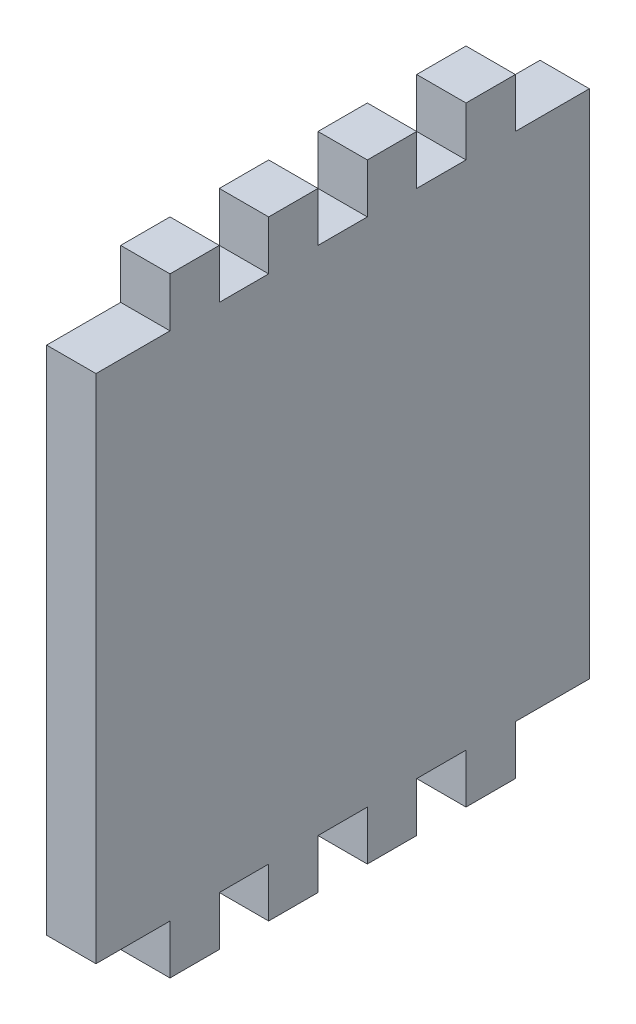
ISO-10303-21;
HEADER;
FILE_DESCRIPTION(('STEP AP214'),'2;1');
FILE_NAME('part.step','',(''),(''),'','','');
FILE_SCHEMA(('AUTOMOTIVE_DESIGN { 1 0 10303 214 1 1 1 1 }'));
ENDSEC;
DATA;
#1=APPLICATION_CONTEXT('core data for automotive mechanical design processes');
#2=APPLICATION_PROTOCOL_DEFINITION('international standard','automotive_design',2000,#1);
#3=PRODUCT_CONTEXT('',#1,'mechanical');
#4=PRODUCT('Part','Part','',(#3));
#5=PRODUCT_RELATED_PRODUCT_CATEGORY('part','',(#4));
#6=PRODUCT_DEFINITION_FORMATION('','',#4);
#7=PRODUCT_DEFINITION_CONTEXT('part definition',#1,'design');
#8=PRODUCT_DEFINITION('design','',#6,#7);
#9=PRODUCT_DEFINITION_SHAPE('','',#8);
#10=(LENGTH_UNIT() NAMED_UNIT(*) SI_UNIT(.MILLI.,.METRE.));
#11=(NAMED_UNIT(*) PLANE_ANGLE_UNIT() SI_UNIT($,.RADIAN.));
#12=(NAMED_UNIT(*) SI_UNIT($,.STERADIAN.) SOLID_ANGLE_UNIT());
#13=UNCERTAINTY_MEASURE_WITH_UNIT(LENGTH_MEASURE(1.E-05),#10,'distance_accuracy_value','');
#14=(GEOMETRIC_REPRESENTATION_CONTEXT(3) GLOBAL_UNCERTAINTY_ASSIGNED_CONTEXT((#13)) GLOBAL_UNIT_ASSIGNED_CONTEXT((#10,
#11,#12)) REPRESENTATION_CONTEXT('',''));
#15=CARTESIAN_POINT('',(0.,0.,0.));
#16=DIRECTION('',(0.,0.,1.));
#17=DIRECTION('',(1.,0.,0.));
#18=AXIS2_PLACEMENT_3D('',#15,#16,#17);
#19=CARTESIAN_POINT('',(5.08,-38.5418998104265,20.2236966824645));
#20=DIRECTION('',(0.,1.,0.));
#21=DIRECTION('',(0.,0.,1.));
#22=AXIS2_PLACEMENT_3D('',#19,#20,#21);
#23=PLANE('',#22);
#24=DIRECTION('',(0.,0.,-1.));
#25=VECTOR('',#24,1.);
#26=CARTESIAN_POINT('',(5.08,-38.5418998104265,20.2236966824645));
#27=LINE('',#26,#25);
#28=CARTESIAN_POINT('',(5.08,-38.5418998104265,-12.7963033175355));
#29=VERTEX_POINT('',#28);
#30=CARTESIAN_POINT('',(5.08,-38.5418998104265,-17.8763033175355));
#31=VERTEX_POINT('',#30);
#32=EDGE_CURVE('E55',#29,#31,#27,.T.);
#33=ORIENTED_EDGE('',*,*,#32,.F.);
#34=DIRECTION('',(1.,0.,0.));
#35=VECTOR('',#34,1.);
#36=CARTESIAN_POINT('',(0.,-38.5418998104265,-12.7963033175355));
#37=LINE('',#36,#35);
#38=CARTESIAN_POINT('',(0.,-38.5418998104265,-12.7963033175355));
#39=VERTEX_POINT('',#38);
#40=EDGE_CURVE('E314',#39,#29,#37,.T.);
#41=ORIENTED_EDGE('',*,*,#40,.F.);
#42=DIRECTION('',(0.,0.,-1.));
#43=VECTOR('',#42,1.);
#44=CARTESIAN_POINT('',(0.,-38.5418998104265,20.2236966824645));
#45=LINE('',#44,#43);
#46=CARTESIAN_POINT('',(0.,-38.5418998104265,-17.8763033175355));
#47=VERTEX_POINT('',#46);
#48=EDGE_CURVE('E613',#39,#47,#45,.T.);
#49=ORIENTED_EDGE('',*,*,#48,.T.);
#50=DIRECTION('',(1.,0.,0.));
#51=VECTOR('',#50,1.);
#52=CARTESIAN_POINT('',(0.,-38.5418998104265,-17.8763033175355));
#53=LINE('',#52,#51);
#54=EDGE_CURVE('E335',#47,#31,#53,.T.);
#55=ORIENTED_EDGE('',*,*,#54,.T.);
#56=EDGE_LOOP('',(#33,#41,#49,#55));
#57=FACE_BOUND('',#56,.T.);
#58=ADVANCED_FACE('F39',(#57),#23,.F.);
#59=CARTESIAN_POINT('',(5.08,-38.5418998104265,-22.9563033175355));
#60=VERTEX_POINT('',#59);
#61=CARTESIAN_POINT('',(5.08,-38.5418998104265,-30.5763033175355));
#62=VERTEX_POINT('',#61);
#63=EDGE_CURVE('E584',#60,#62,#27,.T.);
#64=ORIENTED_EDGE('',*,*,#63,.F.);
#65=DIRECTION('',(1.,0.,0.));
#66=VECTOR('',#65,1.);
#67=CARTESIAN_POINT('',(0.,-38.5418998104265,-22.9563033175355));
#68=LINE('',#67,#66);
#69=CARTESIAN_POINT('',(0.,-38.5418998104265,-22.9563033175355));
#70=VERTEX_POINT('',#69);
#71=EDGE_CURVE('E346',#70,#60,#68,.T.);
#72=ORIENTED_EDGE('',*,*,#71,.F.);
#73=CARTESIAN_POINT('',(0.,-38.5418998104265,-30.5763033175355));
#74=VERTEX_POINT('',#73);
#75=EDGE_CURVE('E607',#70,#74,#45,.T.);
#76=ORIENTED_EDGE('',*,*,#75,.T.);
#77=DIRECTION('',(-1.,0.,0.));
#78=VECTOR('',#77,1.);
#79=CARTESIAN_POINT('',(5.08,-38.5418998104265,-30.5763033175355));
#80=LINE('',#79,#78);
#81=EDGE_CURVE('E48',#62,#74,#80,.T.);
#82=ORIENTED_EDGE('',*,*,#81,.F.);
#83=EDGE_LOOP('',(#64,#72,#76,#82));
#84=FACE_BOUND('',#83,.T.);
#85=ADVANCED_FACE('F737',(#84),#23,.F.);
#86=CARTESIAN_POINT('',(5.08,-38.5418998104265,7.52369668246447));
#87=VERTEX_POINT('',#86);
#88=CARTESIAN_POINT('',(5.08,-38.5418998104265,2.44369668246447));
#89=VERTEX_POINT('',#88);
#90=EDGE_CURVE('E591',#87,#89,#27,.T.);
#91=ORIENTED_EDGE('',*,*,#90,.F.);
#92=DIRECTION('',(1.,0.,0.));
#93=VECTOR('',#92,1.);
#94=CARTESIAN_POINT('',(0.,-38.5418998104265,7.52369668246447));
#95=LINE('',#94,#93);
#96=CARTESIAN_POINT('',(0.,-38.5418998104265,7.52369668246447));
#97=VERTEX_POINT('',#96);
#98=EDGE_CURVE('E372',#97,#87,#95,.T.);
#99=ORIENTED_EDGE('',*,*,#98,.F.);
#100=CARTESIAN_POINT('',(0.,-38.5418998104265,2.44369668246447));
#101=VERTEX_POINT('',#100);
#102=EDGE_CURVE('E612',#97,#101,#45,.T.);
#103=ORIENTED_EDGE('',*,*,#102,.T.);
#104=DIRECTION('',(1.,0.,0.));
#105=VECTOR('',#104,1.);
#106=CARTESIAN_POINT('',(0.,-38.5418998104265,2.44369668246447));
#107=LINE('',#106,#105);
#108=EDGE_CURVE('E426',#101,#89,#107,.T.);
#109=ORIENTED_EDGE('',*,*,#108,.T.);
#110=EDGE_LOOP('',(#91,#99,#103,#109));
#111=FACE_BOUND('',#110,.T.);
#112=ADVANCED_FACE('F718',(#111),#23,.F.);
#113=CARTESIAN_POINT('',(0.,-38.5418998104265,-2.63630331753553));
#114=VERTEX_POINT('',#113);
#115=CARTESIAN_POINT('',(0.,-38.5418998104265,-7.71630331753552));
#116=VERTEX_POINT('',#115);
#117=EDGE_CURVE('E614',#114,#116,#45,.T.);
#118=ORIENTED_EDGE('',*,*,#117,.T.);
#119=DIRECTION('',(1.,0.,0.));
#120=VECTOR('',#119,1.);
#121=CARTESIAN_POINT('',(0.,-38.5418998104265,-7.71630331753552));
#122=LINE('',#121,#120);
#123=CARTESIAN_POINT('',(5.08,-38.5418998104265,-7.71630331753552));
#124=VERTEX_POINT('',#123);
#125=EDGE_CURVE('E63',#116,#124,#122,.T.);
#126=ORIENTED_EDGE('',*,*,#125,.T.);
#127=CARTESIAN_POINT('',(5.08,-38.5418998104265,-2.63630331753553));
#128=VERTEX_POINT('',#127);
#129=EDGE_CURVE('E592',#128,#124,#27,.T.);
#130=ORIENTED_EDGE('',*,*,#129,.F.);
#131=DIRECTION('',(1.,0.,0.));
#132=VECTOR('',#131,1.);
#133=CARTESIAN_POINT('',(0.,-38.5418998104265,-2.63630331753553));
#134=LINE('',#133,#132);
#135=EDGE_CURVE('E408',#114,#128,#134,.T.);
#136=ORIENTED_EDGE('',*,*,#135,.F.);
#137=EDGE_LOOP('',(#118,#126,#130,#136));
#138=FACE_BOUND('',#137,.T.);
#139=ADVANCED_FACE('F743',(#138),#23,.F.);
#140=CARTESIAN_POINT('',(5.08,14.0843601895735,20.2236966824645));
#141=DIRECTION('',(0.,-1.,0.));
#142=DIRECTION('',(0.,0.,-1.));
#143=AXIS2_PLACEMENT_3D('',#140,#141,#142);
#144=PLANE('',#143);
#145=DIRECTION('',(0.,0.,1.));
#146=VECTOR('',#145,1.);
#147=CARTESIAN_POINT('',(5.08,14.0843601895735,20.2236966824645));
#148=LINE('',#147,#146);
#149=CARTESIAN_POINT('',(5.08,14.0843601895735,2.44369668246448));
#150=VERTEX_POINT('',#149);
#151=CARTESIAN_POINT('',(5.08,14.0843601895735,7.52369668246448));
#152=VERTEX_POINT('',#151);
#153=EDGE_CURVE('E602',#150,#152,#148,.T.);
#154=ORIENTED_EDGE('',*,*,#153,.F.);
#155=DIRECTION('',(1.,0.,0.));
#156=VECTOR('',#155,1.);
#157=CARTESIAN_POINT('',(0.,14.0843601895735,2.44369668246448));
#158=LINE('',#157,#156);
#159=CARTESIAN_POINT('',(0.,14.0843601895735,2.44369668246448));
#160=VERTEX_POINT('',#159);
#161=EDGE_CURVE('E456',#160,#150,#158,.T.);
#162=ORIENTED_EDGE('',*,*,#161,.F.);
#163=DIRECTION('',(0.,0.,1.));
#164=VECTOR('',#163,1.);
#165=CARTESIAN_POINT('',(0.,14.0843601895735,20.2236966824645));
#166=LINE('',#165,#164);
#167=CARTESIAN_POINT('',(0.,14.0843601895735,7.52369668246448));
#168=VERTEX_POINT('',#167);
#169=EDGE_CURVE('E621',#160,#168,#166,.T.);
#170=ORIENTED_EDGE('',*,*,#169,.T.);
#171=DIRECTION('',(1.,0.,0.));
#172=VECTOR('',#171,1.);
#173=CARTESIAN_POINT('',(0.,14.0843601895735,7.52369668246448));
#174=LINE('',#173,#172);
#175=EDGE_CURVE('E482',#168,#152,#174,.T.);
#176=ORIENTED_EDGE('',*,*,#175,.T.);
#177=EDGE_LOOP('',(#154,#162,#170,#176));
#178=FACE_BOUND('',#177,.T.);
#179=ADVANCED_FACE('F679',(#178),#144,.F.);
#180=CARTESIAN_POINT('',(5.08,14.0843601895735,12.6036966824645));
#181=VERTEX_POINT('',#180);
#182=CARTESIAN_POINT('',(5.08,14.0843601895735,20.2236966824645));
#183=VERTEX_POINT('',#182);
#184=EDGE_CURVE('E595',#181,#183,#148,.T.);
#185=ORIENTED_EDGE('',*,*,#184,.F.);
#186=DIRECTION('',(1.,0.,0.));
#187=VECTOR('',#186,1.);
#188=CARTESIAN_POINT('',(0.,14.0843601895735,12.6036966824645));
#189=LINE('',#188,#187);
#190=CARTESIAN_POINT('',(0.,14.0843601895735,12.6036966824645));
#191=VERTEX_POINT('',#190);
#192=EDGE_CURVE('E493',#191,#181,#189,.T.);
#193=ORIENTED_EDGE('',*,*,#192,.F.);
#194=CARTESIAN_POINT('',(0.,14.0843601895735,20.2236966824645));
#195=VERTEX_POINT('',#194);
#196=EDGE_CURVE('E617',#191,#195,#166,.T.);
#197=ORIENTED_EDGE('',*,*,#196,.T.);
#198=DIRECTION('',(-1.,0.,0.));
#199=VECTOR('',#198,1.);
#200=CARTESIAN_POINT('',(5.08,14.0843601895735,20.2236966824645));
#201=LINE('',#200,#199);
#202=EDGE_CURVE('E600',#183,#195,#201,.T.);
#203=ORIENTED_EDGE('',*,*,#202,.F.);
#204=EDGE_LOOP('',(#185,#193,#197,#203));
#205=FACE_BOUND('',#204,.T.);
#206=ADVANCED_FACE('F698',(#205),#144,.F.);
#207=CARTESIAN_POINT('',(5.08,14.0843601895735,-17.8763033175355));
#208=VERTEX_POINT('',#207);
#209=CARTESIAN_POINT('',(5.08,14.0843601895735,-12.7963033175355));
#210=VERTEX_POINT('',#209);
#211=EDGE_CURVE('E601',#208,#210,#148,.T.);
#212=ORIENTED_EDGE('',*,*,#211,.F.);
#213=DIRECTION('',(1.,0.,0.));
#214=VECTOR('',#213,1.);
#215=CARTESIAN_POINT('',(0.,14.0843601895735,-17.8763033175355));
#216=LINE('',#215,#214);
#217=CARTESIAN_POINT('',(0.,14.0843601895735,-17.8763033175355));
#218=VERTEX_POINT('',#217);
#219=EDGE_CURVE('E520',#218,#208,#216,.T.);
#220=ORIENTED_EDGE('',*,*,#219,.F.);
#221=CARTESIAN_POINT('',(0.,14.0843601895735,-12.7963033175355));
#222=VERTEX_POINT('',#221);
#223=EDGE_CURVE('E620',#218,#222,#166,.T.);
#224=ORIENTED_EDGE('',*,*,#223,.T.);
#225=DIRECTION('',(1.,0.,0.));
#226=VECTOR('',#225,1.);
#227=CARTESIAN_POINT('',(0.,14.0843601895735,-12.7963033175355));
#228=LINE('',#227,#226);
#229=EDGE_CURVE('E574',#222,#210,#228,.T.);
#230=ORIENTED_EDGE('',*,*,#229,.T.);
#231=EDGE_LOOP('',(#212,#220,#224,#230));
#232=FACE_BOUND('',#231,.T.);
#233=ADVANCED_FACE('F668',(#232),#144,.F.);
#234=CARTESIAN_POINT('',(0.,14.0843601895735,-7.71630331753552));
#235=VERTEX_POINT('',#234);
#236=CARTESIAN_POINT('',(0.,14.0843601895735,-2.63630331753552));
#237=VERTEX_POINT('',#236);
#238=EDGE_CURVE('E622',#235,#237,#166,.T.);
#239=ORIENTED_EDGE('',*,*,#238,.T.);
#240=DIRECTION('',(1.,0.,0.));
#241=VECTOR('',#240,1.);
#242=CARTESIAN_POINT('',(0.,14.0843601895735,-2.63630331753552));
#243=LINE('',#242,#241);
#244=CARTESIAN_POINT('',(5.08,14.0843601895735,-2.63630331753552));
#245=VERTEX_POINT('',#244);
#246=EDGE_CURVE('E445',#237,#245,#243,.T.);
#247=ORIENTED_EDGE('',*,*,#246,.T.);
#248=CARTESIAN_POINT('',(5.08,14.0843601895735,-7.71630331753552));
#249=VERTEX_POINT('',#248);
#250=EDGE_CURVE('E603',#249,#245,#148,.T.);
#251=ORIENTED_EDGE('',*,*,#250,.F.);
#252=DIRECTION('',(1.,0.,0.));
#253=VECTOR('',#252,1.);
#254=CARTESIAN_POINT('',(0.,14.0843601895735,-7.71630331753552));
#255=LINE('',#254,#253);
#256=EDGE_CURVE('E556',#235,#249,#255,.T.);
#257=ORIENTED_EDGE('',*,*,#256,.F.);
#258=EDGE_LOOP('',(#239,#247,#251,#257));
#259=FACE_BOUND('',#258,.T.);
#260=ADVANCED_FACE('F775',(#259),#144,.F.);
#261=CARTESIAN_POINT('',(5.08,14.0843601895735,20.2236966824645));
#262=DIRECTION('',(0.,0.,-1.));
#263=DIRECTION('',(0.,1.,0.));
#264=AXIS2_PLACEMENT_3D('',#261,#262,#263);
#265=PLANE('',#264);
#266=DIRECTION('',(0.,-1.,0.));
#267=VECTOR('',#266,1.);
#268=CARTESIAN_POINT('',(0.,14.0843601895735,20.2236966824645));
#269=LINE('',#268,#267);
#270=CARTESIAN_POINT('',(0.,-38.5418998104265,20.2236966824645));
#271=VERTEX_POINT('',#270);
#272=EDGE_CURVE('E570',#195,#271,#269,.T.);
#273=ORIENTED_EDGE('',*,*,#272,.T.);
#274=DIRECTION('',(-1.,0.,0.));
#275=VECTOR('',#274,1.);
#276=CARTESIAN_POINT('',(5.08,-38.5418998104265,20.2236966824645));
#277=LINE('',#276,#275);
#278=CARTESIAN_POINT('',(5.08,-38.5418998104265,20.2236966824645));
#279=VERTEX_POINT('',#278);
#280=EDGE_CURVE('E11',#279,#271,#277,.T.);
#281=ORIENTED_EDGE('',*,*,#280,.F.);
#282=DIRECTION('',(0.,-1.,0.));
#283=VECTOR('',#282,1.);
#284=CARTESIAN_POINT('',(5.08,14.0843601895735,20.2236966824645));
#285=LINE('',#284,#283);
#286=EDGE_CURVE('E580',#183,#279,#285,.T.);
#287=ORIENTED_EDGE('',*,*,#286,.F.);
#288=ORIENTED_EDGE('',*,*,#202,.T.);
#289=EDGE_LOOP('',(#273,#281,#287,#288));
#290=FACE_BOUND('',#289,.T.);
#291=ADVANCED_FACE('F41',(#290),#265,.F.);
#292=CARTESIAN_POINT('',(0.,-38.5418998104265,12.6036966824645));
#293=VERTEX_POINT('',#292);
#294=EDGE_CURVE('E608',#271,#293,#45,.T.);
#295=ORIENTED_EDGE('',*,*,#294,.T.);
#296=DIRECTION('',(1.,0.,0.));
#297=VECTOR('',#296,1.);
#298=CARTESIAN_POINT('',(0.,-38.5418998104265,12.6036966824645));
#299=LINE('',#298,#297);
#300=CARTESIAN_POINT('',(5.08,-38.5418998104265,12.6036966824645));
#301=VERTEX_POINT('',#300);
#302=EDGE_CURVE('E390',#293,#301,#299,.T.);
#303=ORIENTED_EDGE('',*,*,#302,.T.);
#304=EDGE_CURVE('E586',#279,#301,#27,.T.);
#305=ORIENTED_EDGE('',*,*,#304,.F.);
#306=ORIENTED_EDGE('',*,*,#280,.T.);
#307=EDGE_LOOP('',(#295,#303,#305,#306));
#308=FACE_BOUND('',#307,.T.);
#309=ADVANCED_FACE('F701',(#308),#23,.F.);
#310=CARTESIAN_POINT('',(5.08,14.0843601895735,-30.5763033175355));
#311=DIRECTION('',(0.,0.,1.));
#312=DIRECTION('',(0.,-1.,0.));
#313=AXIS2_PLACEMENT_3D('',#310,#311,#312);
#314=PLANE('',#313);
#315=DIRECTION('',(0.,1.,0.));
#316=VECTOR('',#315,1.);
#317=CARTESIAN_POINT('',(0.,14.0843601895735,-30.5763033175355));
#318=LINE('',#317,#316);
#319=CARTESIAN_POINT('',(0.,14.0843601895735,-30.5763033175355));
#320=VERTEX_POINT('',#319);
#321=EDGE_CURVE('E611',#74,#320,#318,.T.);
#322=ORIENTED_EDGE('',*,*,#321,.T.);
#323=DIRECTION('',(-1.,0.,0.));
#324=VECTOR('',#323,1.);
#325=CARTESIAN_POINT('',(5.08,14.0843601895735,-30.5763033175355));
#326=LINE('',#325,#324);
#327=CARTESIAN_POINT('',(5.08,14.0843601895735,-30.5763033175355));
#328=VERTEX_POINT('',#327);
#329=EDGE_CURVE('E626',#328,#320,#326,.T.);
#330=ORIENTED_EDGE('',*,*,#329,.F.);
#331=DIRECTION('',(0.,1.,0.));
#332=VECTOR('',#331,1.);
#333=CARTESIAN_POINT('',(5.08,14.0843601895735,-30.5763033175355));
#334=LINE('',#333,#332);
#335=EDGE_CURVE('E590',#62,#328,#334,.T.);
#336=ORIENTED_EDGE('',*,*,#335,.F.);
#337=ORIENTED_EDGE('',*,*,#81,.T.);
#338=EDGE_LOOP('',(#322,#330,#336,#337));
#339=FACE_BOUND('',#338,.T.);
#340=ADVANCED_FACE('F635',(#339),#314,.F.);
#341=CARTESIAN_POINT('',(0.,14.0843601895735,-22.9563033175355));
#342=VERTEX_POINT('',#341);
#343=EDGE_CURVE('E585',#320,#342,#166,.T.);
#344=ORIENTED_EDGE('',*,*,#343,.T.);
#345=DIRECTION('',(1.,0.,0.));
#346=VECTOR('',#345,1.);
#347=CARTESIAN_POINT('',(0.,14.0843601895735,-22.9563033175355));
#348=LINE('',#347,#346);
#349=CARTESIAN_POINT('',(5.08,14.0843601895735,-22.9563033175355));
#350=VERTEX_POINT('',#349);
#351=EDGE_CURVE('E538',#342,#350,#348,.T.);
#352=ORIENTED_EDGE('',*,*,#351,.T.);
#353=EDGE_CURVE('E596',#328,#350,#148,.T.);
#354=ORIENTED_EDGE('',*,*,#353,.F.);
#355=ORIENTED_EDGE('',*,*,#329,.T.);
#356=EDGE_LOOP('',(#344,#352,#354,#355));
#357=FACE_BOUND('',#356,.T.);
#358=ADVANCED_FACE('F645',(#357),#144,.F.);
#359=CARTESIAN_POINT('',(5.08,0.,0.));
#360=DIRECTION('',(1.,0.,0.));
#361=DIRECTION('',(0.,0.,-1.));
#362=AXIS2_PLACEMENT_3D('',#359,#360,#361);
#363=PLANE('',#362);
#364=ORIENTED_EDGE('',*,*,#286,.T.);
#365=ORIENTED_EDGE('',*,*,#304,.T.);
#366=DIRECTION('',(0.,-1.,0.));
#367=VECTOR('',#366,1.);
#368=CARTESIAN_POINT('',(5.08,-38.5418998104265,12.6036966824645));
#369=LINE('',#368,#367);
#370=CARTESIAN_POINT('',(5.08,-43.6218998104266,12.6036966824645));
#371=VERTEX_POINT('',#370);
#372=EDGE_CURVE('E376',#301,#371,#369,.T.);
#373=ORIENTED_EDGE('',*,*,#372,.T.);
#374=DIRECTION('',(0.,0.,-1.));
#375=VECTOR('',#374,1.);
#376=CARTESIAN_POINT('',(5.08,-43.6218998104265,7.52369668246447));
#377=LINE('',#376,#375);
#378=CARTESIAN_POINT('',(5.08,-43.6218998104265,7.52369668246447));
#379=VERTEX_POINT('',#378);
#380=EDGE_CURVE('E364',#371,#379,#377,.T.);
#381=ORIENTED_EDGE('',*,*,#380,.T.);
#382=DIRECTION('',(0.,1.,0.));
#383=VECTOR('',#382,1.);
#384=CARTESIAN_POINT('',(5.08,-38.5418998104265,7.52369668246447));
#385=LINE('',#384,#383);
#386=EDGE_CURVE('E350',#379,#87,#385,.T.);
#387=ORIENTED_EDGE('',*,*,#386,.T.);
#388=ORIENTED_EDGE('',*,*,#90,.T.);
#389=DIRECTION('',(0.,-1.,0.));
#390=VECTOR('',#389,1.);
#391=CARTESIAN_POINT('',(5.08,-38.5418998104265,2.44369668246447));
#392=LINE('',#391,#390);
#393=CARTESIAN_POINT('',(5.08,-43.6218998104265,2.44369668246447));
#394=VERTEX_POINT('',#393);
#395=EDGE_CURVE('E412',#89,#394,#392,.T.);
#396=ORIENTED_EDGE('',*,*,#395,.T.);
#397=DIRECTION('',(0.,0.,-1.));
#398=VECTOR('',#397,1.);
#399=CARTESIAN_POINT('',(5.08,-43.6218998104265,-2.63630331753553));
#400=LINE('',#399,#398);
#401=CARTESIAN_POINT('',(5.08,-43.6218998104265,-2.63630331753553));
#402=VERTEX_POINT('',#401);
#403=EDGE_CURVE('E400',#394,#402,#400,.T.);
#404=ORIENTED_EDGE('',*,*,#403,.T.);
#405=DIRECTION('',(0.,1.,0.));
#406=VECTOR('',#405,1.);
#407=CARTESIAN_POINT('',(5.08,-38.5418998104265,-2.63630331753553));
#408=LINE('',#407,#406);
#409=EDGE_CURVE('E386',#402,#128,#408,.T.);
#410=ORIENTED_EDGE('',*,*,#409,.T.);
#411=ORIENTED_EDGE('',*,*,#129,.T.);
#412=DIRECTION('',(0.,-1.,0.));
#413=VECTOR('',#412,1.);
#414=CARTESIAN_POINT('',(5.08,-38.5418998104265,-7.71630331753552));
#415=LINE('',#414,#413);
#416=CARTESIAN_POINT('',(5.08,-43.6218998104265,-7.71630331753552));
#417=VERTEX_POINT('',#416);
#418=EDGE_CURVE('E309',#124,#417,#415,.T.);
#419=ORIENTED_EDGE('',*,*,#418,.T.);
#420=DIRECTION('',(0.,0.,-1.));
#421=VECTOR('',#420,1.);
#422=CARTESIAN_POINT('',(5.08,-43.6218998104265,-7.71630331753552));
#423=LINE('',#422,#421);
#424=CARTESIAN_POINT('',(5.08,-43.6218998104265,-12.7963033175355));
#425=VERTEX_POINT('',#424);
#426=EDGE_CURVE('E281',#417,#425,#423,.T.);
#427=ORIENTED_EDGE('',*,*,#426,.T.);
#428=DIRECTION('',(0.,1.,0.));
#429=VECTOR('',#428,1.);
#430=CARTESIAN_POINT('',(5.08,-38.5418998104265,-12.7963033175355));
#431=LINE('',#430,#429);
#432=EDGE_CURVE('E301',#425,#29,#431,.T.);
#433=ORIENTED_EDGE('',*,*,#432,.T.);
#434=ORIENTED_EDGE('',*,*,#32,.T.);
#435=DIRECTION('',(0.,-1.,0.));
#436=VECTOR('',#435,1.);
#437=CARTESIAN_POINT('',(5.08,-38.5418998104265,-17.8763033175355));
#438=LINE('',#437,#436);
#439=CARTESIAN_POINT('',(5.08,-43.6218998104265,-17.8763033175355));
#440=VERTEX_POINT('',#439);
#441=EDGE_CURVE('E317',#31,#440,#438,.T.);
#442=ORIENTED_EDGE('',*,*,#441,.T.);
#443=DIRECTION('',(0.,0.,-1.));
#444=VECTOR('',#443,1.);
#445=CARTESIAN_POINT('',(5.08,-43.6218998104265,-17.8763033175355));
#446=LINE('',#445,#444);
#447=CARTESIAN_POINT('',(5.08,-43.6218998104265,-22.9563033175355));
#448=VERTEX_POINT('',#447);
#449=EDGE_CURVE('E339',#440,#448,#446,.T.);
#450=ORIENTED_EDGE('',*,*,#449,.T.);
#451=DIRECTION('',(0.,1.,0.));
#452=VECTOR('',#451,1.);
#453=CARTESIAN_POINT('',(5.08,-38.5418998104265,-22.9563033175355));
#454=LINE('',#453,#452);
#455=EDGE_CURVE('E327',#448,#60,#454,.T.);
#456=ORIENTED_EDGE('',*,*,#455,.T.);
#457=ORIENTED_EDGE('',*,*,#63,.T.);
#458=ORIENTED_EDGE('',*,*,#335,.T.);
#459=ORIENTED_EDGE('',*,*,#353,.T.);
#460=DIRECTION('',(0.,1.,0.));
#461=VECTOR('',#460,1.);
#462=CARTESIAN_POINT('',(5.08,14.0843601895735,-22.9563033175355));
#463=LINE('',#462,#461);
#464=CARTESIAN_POINT('',(5.08,19.1643601895735,-22.9563033175355));
#465=VERTEX_POINT('',#464);
#466=EDGE_CURVE('E524',#350,#465,#463,.T.);
#467=ORIENTED_EDGE('',*,*,#466,.T.);
#468=DIRECTION('',(0.,0.,1.));
#469=VECTOR('',#468,1.);
#470=CARTESIAN_POINT('',(5.08,19.1643601895735,-17.8763033175355));
#471=LINE('',#470,#469);
#472=CARTESIAN_POINT('',(5.08,19.1643601895735,-17.8763033175355));
#473=VERTEX_POINT('',#472);
#474=EDGE_CURVE('E512',#465,#473,#471,.T.);
#475=ORIENTED_EDGE('',*,*,#474,.T.);
#476=DIRECTION('',(0.,-1.,0.));
#477=VECTOR('',#476,1.);
#478=CARTESIAN_POINT('',(5.08,14.0843601895735,-17.8763033175355));
#479=LINE('',#478,#477);
#480=EDGE_CURVE('E497',#473,#208,#479,.T.);
#481=ORIENTED_EDGE('',*,*,#480,.T.);
#482=ORIENTED_EDGE('',*,*,#211,.T.);
#483=DIRECTION('',(0.,1.,0.));
#484=VECTOR('',#483,1.);
#485=CARTESIAN_POINT('',(5.08,14.0843601895735,-12.7963033175355));
#486=LINE('',#485,#484);
#487=CARTESIAN_POINT('',(5.08,19.1643601895735,-12.7963033175355));
#488=VERTEX_POINT('',#487);
#489=EDGE_CURVE('E560',#210,#488,#486,.T.);
#490=ORIENTED_EDGE('',*,*,#489,.T.);
#491=DIRECTION('',(0.,0.,1.));
#492=VECTOR('',#491,1.);
#493=CARTESIAN_POINT('',(5.08,19.1643601895735,-7.71630331753552));
#494=LINE('',#493,#492);
#495=CARTESIAN_POINT('',(5.08,19.1643601895735,-7.71630331753552));
#496=VERTEX_POINT('',#495);
#497=EDGE_CURVE('E548',#488,#496,#494,.T.);
#498=ORIENTED_EDGE('',*,*,#497,.T.);
#499=DIRECTION('',(0.,-1.,0.));
#500=VECTOR('',#499,1.);
#501=CARTESIAN_POINT('',(5.08,14.0843601895735,-7.71630331753552));
#502=LINE('',#501,#500);
#503=EDGE_CURVE('E534',#496,#249,#502,.T.);
#504=ORIENTED_EDGE('',*,*,#503,.T.);
#505=ORIENTED_EDGE('',*,*,#250,.T.);
#506=DIRECTION('',(0.,1.,0.));
#507=VECTOR('',#506,1.);
#508=CARTESIAN_POINT('',(5.08,14.0843601895735,-2.63630331753552));
#509=LINE('',#508,#507);
#510=CARTESIAN_POINT('',(5.08,19.1643601895735,-2.63630331753552));
#511=VERTEX_POINT('',#510);
#512=EDGE_CURVE('E422',#245,#511,#509,.T.);
#513=ORIENTED_EDGE('',*,*,#512,.T.);
#514=DIRECTION('',(0.,0.,1.));
#515=VECTOR('',#514,1.);
#516=CARTESIAN_POINT('',(5.08,19.1643601895735,-2.63630331753552));
#517=LINE('',#516,#515);
#518=CARTESIAN_POINT('',(5.08,19.1643601895735,2.44369668246448));
#519=VERTEX_POINT('',#518);
#520=EDGE_CURVE('E449',#511,#519,#517,.T.);
#521=ORIENTED_EDGE('',*,*,#520,.T.);
#522=DIRECTION('',(0.,-1.,0.));
#523=VECTOR('',#522,1.);
#524=CARTESIAN_POINT('',(5.08,14.0843601895735,2.44369668246448));
#525=LINE('',#524,#523);
#526=EDGE_CURVE('E437',#519,#150,#525,.T.);
#527=ORIENTED_EDGE('',*,*,#526,.T.);
#528=ORIENTED_EDGE('',*,*,#153,.T.);
#529=DIRECTION('',(0.,1.,0.));
#530=VECTOR('',#529,1.);
#531=CARTESIAN_POINT('',(5.08,14.0843601895735,7.52369668246448));
#532=LINE('',#531,#530);
#533=CARTESIAN_POINT('',(5.08,19.1643601895735,7.52369668246448));
#534=VERTEX_POINT('',#533);
#535=EDGE_CURVE('E460',#152,#534,#532,.T.);
#536=ORIENTED_EDGE('',*,*,#535,.T.);
#537=DIRECTION('',(0.,0.,1.));
#538=VECTOR('',#537,1.);
#539=CARTESIAN_POINT('',(5.08,19.1643601895735,7.52369668246448));
#540=LINE('',#539,#538);
#541=CARTESIAN_POINT('',(5.08,19.1643601895735,12.6036966824645));
#542=VERTEX_POINT('',#541);
#543=EDGE_CURVE('E486',#534,#542,#540,.T.);
#544=ORIENTED_EDGE('',*,*,#543,.T.);
#545=DIRECTION('',(0.,-1.,0.));
#546=VECTOR('',#545,1.);
#547=CARTESIAN_POINT('',(5.08,14.0843601895735,12.6036966824645));
#548=LINE('',#547,#546);
#549=EDGE_CURVE('E474',#542,#181,#548,.T.);
#550=ORIENTED_EDGE('',*,*,#549,.T.);
#551=ORIENTED_EDGE('',*,*,#184,.T.);
#552=EDGE_LOOP('',(#364,#365,#373,#381,#387,#388,#396,#404,#410,#411,#419,#427,#433,#434,#442,
#450,#456,#457,#458,#459,#467,#475,#481,#482,#490,#498,#504,#505,#513,#521,#527,#528,#536,#544,
#550,#551));
#553=FACE_BOUND('',#552,.T.);
#554=ADVANCED_FACE('F652',(#553),#363,.T.);
#555=CARTESIAN_POINT('',(0.,0.,0.));
#556=DIRECTION('',(1.,0.,0.));
#557=DIRECTION('',(0.,0.,-1.));
#558=AXIS2_PLACEMENT_3D('',#555,#556,#557);
#559=PLANE('',#558);
#560=ORIENTED_EDGE('',*,*,#272,.F.);
#561=ORIENTED_EDGE('',*,*,#196,.F.);
#562=DIRECTION('',(0.,-1.,0.));
#563=VECTOR('',#562,1.);
#564=CARTESIAN_POINT('',(0.,14.0843601895735,12.6036966824645));
#565=LINE('',#564,#563);
#566=CARTESIAN_POINT('',(0.,19.1643601895735,12.6036966824645));
#567=VERTEX_POINT('',#566);
#568=EDGE_CURVE('E478',#567,#191,#565,.T.);
#569=ORIENTED_EDGE('',*,*,#568,.F.);
#570=DIRECTION('',(0.,0.,1.));
#571=VECTOR('',#570,1.);
#572=CARTESIAN_POINT('',(0.,19.1643601895735,7.52369668246448));
#573=LINE('',#572,#571);
#574=CARTESIAN_POINT('',(0.,19.1643601895735,7.52369668246448));
#575=VERTEX_POINT('',#574);
#576=EDGE_CURVE('E473',#575,#567,#573,.T.);
#577=ORIENTED_EDGE('',*,*,#576,.F.);
#578=DIRECTION('',(0.,1.,0.));
#579=VECTOR('',#578,1.);
#580=CARTESIAN_POINT('',(0.,14.0843601895735,7.52369668246448));
#581=LINE('',#580,#579);
#582=EDGE_CURVE('E469',#168,#575,#581,.T.);
#583=ORIENTED_EDGE('',*,*,#582,.F.);
#584=ORIENTED_EDGE('',*,*,#169,.F.);
#585=DIRECTION('',(0.,-1.,0.));
#586=VECTOR('',#585,1.);
#587=CARTESIAN_POINT('',(0.,14.0843601895735,2.44369668246448));
#588=LINE('',#587,#586);
#589=CARTESIAN_POINT('',(0.,19.1643601895735,2.44369668246448));
#590=VERTEX_POINT('',#589);
#591=EDGE_CURVE('E441',#590,#160,#588,.T.);
#592=ORIENTED_EDGE('',*,*,#591,.F.);
#593=DIRECTION('',(0.,0.,1.));
#594=VECTOR('',#593,1.);
#595=CARTESIAN_POINT('',(0.,19.1643601895735,-2.63630331753552));
#596=LINE('',#595,#594);
#597=CARTESIAN_POINT('',(0.,19.1643601895735,-2.63630331753552));
#598=VERTEX_POINT('',#597);
#599=EDGE_CURVE('E436',#598,#590,#596,.T.);
#600=ORIENTED_EDGE('',*,*,#599,.F.);
#601=DIRECTION('',(0.,1.,0.));
#602=VECTOR('',#601,1.);
#603=CARTESIAN_POINT('',(0.,14.0843601895735,-2.63630331753552));
#604=LINE('',#603,#602);
#605=EDGE_CURVE('E432',#237,#598,#604,.T.);
#606=ORIENTED_EDGE('',*,*,#605,.F.);
#607=ORIENTED_EDGE('',*,*,#238,.F.);
#608=DIRECTION('',(0.,-1.,0.));
#609=VECTOR('',#608,1.);
#610=CARTESIAN_POINT('',(0.,14.0843601895735,-7.71630331753552));
#611=LINE('',#610,#609);
#612=CARTESIAN_POINT('',(0.,19.1643601895735,-7.71630331753552));
#613=VERTEX_POINT('',#612);
#614=EDGE_CURVE('E544',#613,#235,#611,.T.);
#615=ORIENTED_EDGE('',*,*,#614,.F.);
#616=DIRECTION('',(0.,0.,1.));
#617=VECTOR('',#616,1.);
#618=CARTESIAN_POINT('',(0.,19.1643601895735,-7.71630331753552));
#619=LINE('',#618,#617);
#620=CARTESIAN_POINT('',(0.,19.1643601895735,-12.7963033175355));
#621=VERTEX_POINT('',#620);
#622=EDGE_CURVE('E552',#621,#613,#619,.T.);
#623=ORIENTED_EDGE('',*,*,#622,.F.);
#624=DIRECTION('',(0.,1.,0.));
#625=VECTOR('',#624,1.);
#626=CARTESIAN_POINT('',(0.,14.0843601895735,-12.7963033175355));
#627=LINE('',#626,#625);
#628=EDGE_CURVE('E547',#222,#621,#627,.T.);
#629=ORIENTED_EDGE('',*,*,#628,.F.);
#630=ORIENTED_EDGE('',*,*,#223,.F.);
#631=DIRECTION('',(0.,-1.,0.));
#632=VECTOR('',#631,1.);
#633=CARTESIAN_POINT('',(0.,14.0843601895735,-17.8763033175355));
#634=LINE('',#633,#632);
#635=CARTESIAN_POINT('',(0.,19.1643601895735,-17.8763033175355));
#636=VERTEX_POINT('',#635);
#637=EDGE_CURVE('E507',#636,#218,#634,.T.);
#638=ORIENTED_EDGE('',*,*,#637,.F.);
#639=DIRECTION('',(0.,0.,1.));
#640=VECTOR('',#639,1.);
#641=CARTESIAN_POINT('',(0.,19.1643601895735,-17.8763033175355));
#642=LINE('',#641,#640);
#643=CARTESIAN_POINT('',(0.,19.1643601895735,-22.9563033175355));
#644=VERTEX_POINT('',#643);
#645=EDGE_CURVE('E516',#644,#636,#642,.T.);
#646=ORIENTED_EDGE('',*,*,#645,.F.);
#647=DIRECTION('',(0.,1.,0.));
#648=VECTOR('',#647,1.);
#649=CARTESIAN_POINT('',(0.,14.0843601895735,-22.9563033175355));
#650=LINE('',#649,#648);
#651=EDGE_CURVE('E511',#342,#644,#650,.T.);
#652=ORIENTED_EDGE('',*,*,#651,.F.);
#653=ORIENTED_EDGE('',*,*,#343,.F.);
#654=ORIENTED_EDGE('',*,*,#321,.F.);
#655=ORIENTED_EDGE('',*,*,#75,.F.);
#656=DIRECTION('',(0.,1.,0.));
#657=VECTOR('',#656,1.);
#658=CARTESIAN_POINT('',(0.,-38.5418998104265,-22.9563033175355));
#659=LINE('',#658,#657);
#660=CARTESIAN_POINT('',(0.,-43.6218998104265,-22.9563033175355));
#661=VERTEX_POINT('',#660);
#662=EDGE_CURVE('E331',#661,#70,#659,.T.);
#663=ORIENTED_EDGE('',*,*,#662,.F.);
#664=DIRECTION('',(0.,0.,-1.));
#665=VECTOR('',#664,1.);
#666=CARTESIAN_POINT('',(0.,-43.6218998104265,-17.8763033175355));
#667=LINE('',#666,#665);
#668=CARTESIAN_POINT('',(0.,-43.6218998104265,-17.8763033175355));
#669=VERTEX_POINT('',#668);
#670=EDGE_CURVE('E326',#669,#661,#667,.T.);
#671=ORIENTED_EDGE('',*,*,#670,.F.);
#672=DIRECTION('',(0.,-1.,0.));
#673=VECTOR('',#672,1.);
#674=CARTESIAN_POINT('',(0.,-38.5418998104265,-17.8763033175355));
#675=LINE('',#674,#673);
#676=EDGE_CURVE('E322',#47,#669,#675,.T.);
#677=ORIENTED_EDGE('',*,*,#676,.F.);
#678=ORIENTED_EDGE('',*,*,#48,.F.);
#679=DIRECTION('',(0.,1.,0.));
#680=VECTOR('',#679,1.);
#681=CARTESIAN_POINT('',(0.,-38.5418998104265,-12.7963033175355));
#682=LINE('',#681,#680);
#683=CARTESIAN_POINT('',(0.,-43.6218998104265,-12.7963033175355));
#684=VERTEX_POINT('',#683);
#685=EDGE_CURVE('E296',#684,#39,#682,.T.);
#686=ORIENTED_EDGE('',*,*,#685,.F.);
#687=DIRECTION('',(0.,0.,-1.));
#688=VECTOR('',#687,1.);
#689=CARTESIAN_POINT('',(0.,-43.6218998104265,-7.71630331753552));
#690=LINE('',#689,#688);
#691=CARTESIAN_POINT('',(0.,-43.6218998104265,-7.71630331753552));
#692=VERTEX_POINT('',#691);
#693=EDGE_CURVE('E278',#692,#684,#690,.T.);
#694=ORIENTED_EDGE('',*,*,#693,.F.);
#695=DIRECTION('',(0.,-1.,0.));
#696=VECTOR('',#695,1.);
#697=CARTESIAN_POINT('',(0.,-38.5418998104265,-7.71630331753552));
#698=LINE('',#697,#696);
#699=EDGE_CURVE('E294',#116,#692,#698,.T.);
#700=ORIENTED_EDGE('',*,*,#699,.F.);
#701=ORIENTED_EDGE('',*,*,#117,.F.);
#702=DIRECTION('',(0.,1.,0.));
#703=VECTOR('',#702,1.);
#704=CARTESIAN_POINT('',(0.,-38.5418998104265,-2.63630331753553));
#705=LINE('',#704,#703);
#706=CARTESIAN_POINT('',(0.,-43.6218998104265,-2.63630331753553));
#707=VERTEX_POINT('',#706);
#708=EDGE_CURVE('E396',#707,#114,#705,.T.);
#709=ORIENTED_EDGE('',*,*,#708,.F.);
#710=DIRECTION('',(0.,0.,-1.));
#711=VECTOR('',#710,1.);
#712=CARTESIAN_POINT('',(0.,-43.6218998104265,-2.63630331753553));
#713=LINE('',#712,#711);
#714=CARTESIAN_POINT('',(0.,-43.6218998104265,2.44369668246447));
#715=VERTEX_POINT('',#714);
#716=EDGE_CURVE('E404',#715,#707,#713,.T.);
#717=ORIENTED_EDGE('',*,*,#716,.F.);
#718=DIRECTION('',(0.,-1.,0.));
#719=VECTOR('',#718,1.);
#720=CARTESIAN_POINT('',(0.,-38.5418998104265,2.44369668246447));
#721=LINE('',#720,#719);
#722=EDGE_CURVE('E399',#101,#715,#721,.T.);
#723=ORIENTED_EDGE('',*,*,#722,.F.);
#724=ORIENTED_EDGE('',*,*,#102,.F.);
#725=DIRECTION('',(0.,1.,0.));
#726=VECTOR('',#725,1.);
#727=CARTESIAN_POINT('',(0.,-38.5418998104265,7.52369668246447));
#728=LINE('',#727,#726);
#729=CARTESIAN_POINT('',(0.,-43.6218998104265,7.52369668246447));
#730=VERTEX_POINT('',#729);
#731=EDGE_CURVE('E359',#730,#97,#728,.T.);
#732=ORIENTED_EDGE('',*,*,#731,.F.);
#733=DIRECTION('',(0.,0.,-1.));
#734=VECTOR('',#733,1.);
#735=CARTESIAN_POINT('',(0.,-43.6218998104265,7.52369668246447));
#736=LINE('',#735,#734);
#737=CARTESIAN_POINT('',(0.,-43.6218998104266,12.6036966824645));
#738=VERTEX_POINT('',#737);
#739=EDGE_CURVE('E368',#738,#730,#736,.T.);
#740=ORIENTED_EDGE('',*,*,#739,.F.);
#741=DIRECTION('',(0.,-1.,0.));
#742=VECTOR('',#741,1.);
#743=CARTESIAN_POINT('',(0.,-38.5418998104265,12.6036966824645));
#744=LINE('',#743,#742);
#745=EDGE_CURVE('E363',#293,#738,#744,.T.);
#746=ORIENTED_EDGE('',*,*,#745,.F.);
#747=ORIENTED_EDGE('',*,*,#294,.F.);
#748=EDGE_LOOP('',(#560,#561,#569,#577,#583,#584,#592,#600,#606,#607,#615,#623,#629,#630,#638,
#646,#652,#653,#654,#655,#663,#671,#677,#678,#686,#694,#700,#701,#709,#717,#723,#724,#732,#740,
#746,#747));
#749=FACE_BOUND('',#748,.T.);
#750=ADVANCED_FACE('F292',(#749),#559,.F.);
#751=CARTESIAN_POINT('',(0.,14.0843601895735,-7.71630331753552));
#752=DIRECTION('',(0.,0.,1.));
#753=DIRECTION('',(1.,0.,0.));
#754=AXIS2_PLACEMENT_3D('',#751,#752,#753);
#755=PLANE('',#754);
#756=ORIENTED_EDGE('',*,*,#503,.F.);
#757=DIRECTION('',(1.,0.,0.));
#758=VECTOR('',#757,1.);
#759=CARTESIAN_POINT('',(0.,19.1643601895735,-7.71630331753552));
#760=LINE('',#759,#758);
#761=EDGE_CURVE('E567',#613,#496,#760,.T.);
#762=ORIENTED_EDGE('',*,*,#761,.F.);
#763=ORIENTED_EDGE('',*,*,#614,.T.);
#764=ORIENTED_EDGE('',*,*,#256,.T.);
#765=EDGE_LOOP('',(#756,#762,#763,#764));
#766=FACE_BOUND('',#765,.T.);
#767=ADVANCED_FACE('F852',(#766),#755,.T.);
#768=CARTESIAN_POINT('',(0.,19.1643601895735,-7.71630331753552));
#769=DIRECTION('',(0.,1.,0.));
#770=DIRECTION('',(0.,0.,1.));
#771=AXIS2_PLACEMENT_3D('',#768,#769,#770);
#772=PLANE('',#771);
#773=ORIENTED_EDGE('',*,*,#497,.F.);
#774=DIRECTION('',(1.,0.,0.));
#775=VECTOR('',#774,1.);
#776=CARTESIAN_POINT('',(0.,19.1643601895735,-12.7963033175355));
#777=LINE('',#776,#775);
#778=EDGE_CURVE('E571',#621,#488,#777,.T.);
#779=ORIENTED_EDGE('',*,*,#778,.F.);
#780=ORIENTED_EDGE('',*,*,#622,.T.);
#781=ORIENTED_EDGE('',*,*,#761,.T.);
#782=EDGE_LOOP('',(#773,#779,#780,#781));
#783=FACE_BOUND('',#782,.T.);
#784=ADVANCED_FACE('F889',(#783),#772,.T.);
#785=CARTESIAN_POINT('',(0.,14.0843601895735,-12.7963033175355));
#786=DIRECTION('',(0.,0.,-1.));
#787=DIRECTION('',(-1.,0.,0.));
#788=AXIS2_PLACEMENT_3D('',#785,#786,#787);
#789=PLANE('',#788);
#790=ORIENTED_EDGE('',*,*,#489,.F.);
#791=ORIENTED_EDGE('',*,*,#229,.F.);
#792=ORIENTED_EDGE('',*,*,#628,.T.);
#793=ORIENTED_EDGE('',*,*,#778,.T.);
#794=EDGE_LOOP('',(#790,#791,#792,#793));
#795=FACE_BOUND('',#794,.T.);
#796=ADVANCED_FACE('F666',(#795),#789,.T.);
#797=CARTESIAN_POINT('',(0.,14.0843601895735,-17.8763033175355));
#798=DIRECTION('',(0.,0.,1.));
#799=DIRECTION('',(1.,0.,0.));
#800=AXIS2_PLACEMENT_3D('',#797,#798,#799);
#801=PLANE('',#800);
#802=ORIENTED_EDGE('',*,*,#480,.F.);
#803=DIRECTION('',(1.,0.,0.));
#804=VECTOR('',#803,1.);
#805=CARTESIAN_POINT('',(0.,19.1643601895735,-17.8763033175355));
#806=LINE('',#805,#804);
#807=EDGE_CURVE('E531',#636,#473,#806,.T.);
#808=ORIENTED_EDGE('',*,*,#807,.F.);
#809=ORIENTED_EDGE('',*,*,#637,.T.);
#810=ORIENTED_EDGE('',*,*,#219,.T.);
#811=EDGE_LOOP('',(#802,#808,#809,#810));
#812=FACE_BOUND('',#811,.T.);
#813=ADVANCED_FACE('F658',(#812),#801,.T.);
#814=CARTESIAN_POINT('',(0.,19.1643601895735,-17.8763033175355));
#815=DIRECTION('',(0.,1.,0.));
#816=DIRECTION('',(0.,0.,1.));
#817=AXIS2_PLACEMENT_3D('',#814,#815,#816);
#818=PLANE('',#817);
#819=ORIENTED_EDGE('',*,*,#474,.F.);
#820=DIRECTION('',(1.,0.,0.));
#821=VECTOR('',#820,1.);
#822=CARTESIAN_POINT('',(0.,19.1643601895735,-22.9563033175355));
#823=LINE('',#822,#821);
#824=EDGE_CURVE('E535',#644,#465,#823,.T.);
#825=ORIENTED_EDGE('',*,*,#824,.F.);
#826=ORIENTED_EDGE('',*,*,#645,.T.);
#827=ORIENTED_EDGE('',*,*,#807,.T.);
#828=EDGE_LOOP('',(#819,#825,#826,#827));
#829=FACE_BOUND('',#828,.T.);
#830=ADVANCED_FACE('F654',(#829),#818,.T.);
#831=CARTESIAN_POINT('',(0.,14.0843601895735,-22.9563033175355));
#832=DIRECTION('',(0.,0.,-1.));
#833=DIRECTION('',(-1.,0.,0.));
#834=AXIS2_PLACEMENT_3D('',#831,#832,#833);
#835=PLANE('',#834);
#836=ORIENTED_EDGE('',*,*,#466,.F.);
#837=ORIENTED_EDGE('',*,*,#351,.F.);
#838=ORIENTED_EDGE('',*,*,#651,.T.);
#839=ORIENTED_EDGE('',*,*,#824,.T.);
#840=EDGE_LOOP('',(#836,#837,#838,#839));
#841=FACE_BOUND('',#840,.T.);
#842=ADVANCED_FACE('F649',(#841),#835,.T.);
#843=CARTESIAN_POINT('',(0.,14.0843601895735,12.6036966824645));
#844=DIRECTION('',(0.,0.,1.));
#845=DIRECTION('',(1.,0.,0.));
#846=AXIS2_PLACEMENT_3D('',#843,#844,#845);
#847=PLANE('',#846);
#848=ORIENTED_EDGE('',*,*,#549,.F.);
#849=DIRECTION('',(1.,0.,0.));
#850=VECTOR('',#849,1.);
#851=CARTESIAN_POINT('',(0.,19.1643601895735,12.6036966824645));
#852=LINE('',#851,#850);
#853=EDGE_CURVE('E498',#567,#542,#852,.T.);
#854=ORIENTED_EDGE('',*,*,#853,.F.);
#855=ORIENTED_EDGE('',*,*,#568,.T.);
#856=ORIENTED_EDGE('',*,*,#192,.T.);
#857=EDGE_LOOP('',(#848,#854,#855,#856));
#858=FACE_BOUND('',#857,.T.);
#859=ADVANCED_FACE('F755',(#858),#847,.T.);
#860=CARTESIAN_POINT('',(0.,19.1643601895735,7.52369668246448));
#861=DIRECTION('',(0.,1.,0.));
#862=DIRECTION('',(0.,0.,1.));
#863=AXIS2_PLACEMENT_3D('',#860,#861,#862);
#864=PLANE('',#863);
#865=ORIENTED_EDGE('',*,*,#543,.F.);
#866=DIRECTION('',(1.,0.,0.));
#867=VECTOR('',#866,1.);
#868=CARTESIAN_POINT('',(0.,19.1643601895735,7.52369668246448));
#869=LINE('',#868,#867);
#870=EDGE_CURVE('E501',#575,#534,#869,.T.);
#871=ORIENTED_EDGE('',*,*,#870,.F.);
#872=ORIENTED_EDGE('',*,*,#576,.T.);
#873=ORIENTED_EDGE('',*,*,#853,.T.);
#874=EDGE_LOOP('',(#865,#871,#872,#873));
#875=FACE_BOUND('',#874,.T.);
#876=ADVANCED_FACE('F689',(#875),#864,.T.);
#877=CARTESIAN_POINT('',(0.,14.0843601895735,7.52369668246448));
#878=DIRECTION('',(0.,0.,-1.));
#879=DIRECTION('',(-1.,0.,0.));
#880=AXIS2_PLACEMENT_3D('',#877,#878,#879);
#881=PLANE('',#880);
#882=ORIENTED_EDGE('',*,*,#535,.F.);
#883=ORIENTED_EDGE('',*,*,#175,.F.);
#884=ORIENTED_EDGE('',*,*,#582,.T.);
#885=ORIENTED_EDGE('',*,*,#870,.T.);
#886=EDGE_LOOP('',(#882,#883,#884,#885));
#887=FACE_BOUND('',#886,.T.);
#888=ADVANCED_FACE('F684',(#887),#881,.T.);
#889=CARTESIAN_POINT('',(0.,14.0843601895735,2.44369668246448));
#890=DIRECTION('',(0.,0.,1.));
#891=DIRECTION('',(0.,-1.,0.));
#892=AXIS2_PLACEMENT_3D('',#889,#890,#891);
#893=PLANE('',#892);
#894=ORIENTED_EDGE('',*,*,#526,.F.);
#895=DIRECTION('',(1.,0.,0.));
#896=VECTOR('',#895,1.);
#897=CARTESIAN_POINT('',(0.,19.1643601895735,2.44369668246448));
#898=LINE('',#897,#896);
#899=EDGE_CURVE('E461',#590,#519,#898,.T.);
#900=ORIENTED_EDGE('',*,*,#899,.F.);
#901=ORIENTED_EDGE('',*,*,#591,.T.);
#902=ORIENTED_EDGE('',*,*,#161,.T.);
#903=EDGE_LOOP('',(#894,#900,#901,#902));
#904=FACE_BOUND('',#903,.T.);
#905=ADVANCED_FACE('F948',(#904),#893,.T.);
#906=CARTESIAN_POINT('',(0.,19.1643601895735,-2.63630331753552));
#907=DIRECTION('',(0.,1.,0.));
#908=DIRECTION('',(0.,0.,1.));
#909=AXIS2_PLACEMENT_3D('',#906,#907,#908);
#910=PLANE('',#909);
#911=ORIENTED_EDGE('',*,*,#520,.F.);
#912=DIRECTION('',(1.,0.,0.));
#913=VECTOR('',#912,1.);
#914=CARTESIAN_POINT('',(0.,19.1643601895735,-2.63630331753552));
#915=LINE('',#914,#913);
#916=EDGE_CURVE('E464',#598,#511,#915,.T.);
#917=ORIENTED_EDGE('',*,*,#916,.F.);
#918=ORIENTED_EDGE('',*,*,#599,.T.);
#919=ORIENTED_EDGE('',*,*,#899,.T.);
#920=EDGE_LOOP('',(#911,#917,#918,#919));
#921=FACE_BOUND('',#920,.T.);
#922=ADVANCED_FACE('F957',(#921),#910,.T.);
#923=CARTESIAN_POINT('',(0.,14.0843601895735,-2.63630331753552));
#924=DIRECTION('',(0.,0.,-1.));
#925=DIRECTION('',(0.,1.,0.));
#926=AXIS2_PLACEMENT_3D('',#923,#924,#925);
#927=PLANE('',#926);
#928=ORIENTED_EDGE('',*,*,#512,.F.);
#929=ORIENTED_EDGE('',*,*,#246,.F.);
#930=ORIENTED_EDGE('',*,*,#605,.T.);
#931=ORIENTED_EDGE('',*,*,#916,.T.);
#932=EDGE_LOOP('',(#928,#929,#930,#931));
#933=FACE_BOUND('',#932,.T.);
#934=ADVANCED_FACE('F967',(#933),#927,.T.);
#935=CARTESIAN_POINT('',(0.,-38.5418998104265,-2.63630331753553));
#936=DIRECTION('',(0.,0.,-1.));
#937=DIRECTION('',(0.,1.,0.));
#938=AXIS2_PLACEMENT_3D('',#935,#936,#937);
#939=PLANE('',#938);
#940=ORIENTED_EDGE('',*,*,#409,.F.);
#941=DIRECTION('',(1.,0.,0.));
#942=VECTOR('',#941,1.);
#943=CARTESIAN_POINT('',(0.,-43.6218998104265,-2.63630331753553));
#944=LINE('',#943,#942);
#945=EDGE_CURVE('E419',#707,#402,#944,.T.);
#946=ORIENTED_EDGE('',*,*,#945,.F.);
#947=ORIENTED_EDGE('',*,*,#708,.T.);
#948=ORIENTED_EDGE('',*,*,#135,.T.);
#949=EDGE_LOOP('',(#940,#946,#947,#948));
#950=FACE_BOUND('',#949,.T.);
#951=ADVANCED_FACE('F977',(#950),#939,.T.);
#952=CARTESIAN_POINT('',(0.,-43.6218998104265,-2.63630331753553));
#953=DIRECTION('',(0.,-1.,0.));
#954=DIRECTION('',(0.,0.,-1.));
#955=AXIS2_PLACEMENT_3D('',#952,#953,#954);
#956=PLANE('',#955);
#957=ORIENTED_EDGE('',*,*,#403,.F.);
#958=DIRECTION('',(1.,0.,0.));
#959=VECTOR('',#958,1.);
#960=CARTESIAN_POINT('',(0.,-43.6218998104265,2.44369668246447));
#961=LINE('',#960,#959);
#962=EDGE_CURVE('E423',#715,#394,#961,.T.);
#963=ORIENTED_EDGE('',*,*,#962,.F.);
#964=ORIENTED_EDGE('',*,*,#716,.T.);
#965=ORIENTED_EDGE('',*,*,#945,.T.);
#966=EDGE_LOOP('',(#957,#963,#964,#965));
#967=FACE_BOUND('',#966,.T.);
#968=ADVANCED_FACE('F750',(#967),#956,.T.);
#969=CARTESIAN_POINT('',(0.,-38.5418998104265,2.44369668246447));
#970=DIRECTION('',(0.,0.,1.));
#971=DIRECTION('',(0.,-1.,0.));
#972=AXIS2_PLACEMENT_3D('',#969,#970,#971);
#973=PLANE('',#972);
#974=ORIENTED_EDGE('',*,*,#395,.F.);
#975=ORIENTED_EDGE('',*,*,#108,.F.);
#976=ORIENTED_EDGE('',*,*,#722,.T.);
#977=ORIENTED_EDGE('',*,*,#962,.T.);
#978=EDGE_LOOP('',(#974,#975,#976,#977));
#979=FACE_BOUND('',#978,.T.);
#980=ADVANCED_FACE('F753',(#979),#973,.T.);
#981=CARTESIAN_POINT('',(0.,-38.5418998104265,7.52369668246447));
#982=DIRECTION('',(0.,0.,-1.));
#983=DIRECTION('',(-1.,0.,0.));
#984=AXIS2_PLACEMENT_3D('',#981,#982,#983);
#985=PLANE('',#984);
#986=ORIENTED_EDGE('',*,*,#386,.F.);
#987=DIRECTION('',(1.,0.,0.));
#988=VECTOR('',#987,1.);
#989=CARTESIAN_POINT('',(0.,-43.6218998104265,7.52369668246447));
#990=LINE('',#989,#988);
#991=EDGE_CURVE('E383',#730,#379,#990,.T.);
#992=ORIENTED_EDGE('',*,*,#991,.F.);
#993=ORIENTED_EDGE('',*,*,#731,.T.);
#994=ORIENTED_EDGE('',*,*,#98,.T.);
#995=EDGE_LOOP('',(#986,#992,#993,#994));
#996=FACE_BOUND('',#995,.T.);
#997=ADVANCED_FACE('F714',(#996),#985,.T.);
#998=CARTESIAN_POINT('',(0.,-43.6218998104265,7.52369668246447));
#999=DIRECTION('',(0.,-1.,0.));
#1000=DIRECTION('',(0.,0.,-1.));
#1001=AXIS2_PLACEMENT_3D('',#998,#999,#1000);
#1002=PLANE('',#1001);
#1003=ORIENTED_EDGE('',*,*,#380,.F.);
#1004=DIRECTION('',(1.,0.,0.));
#1005=VECTOR('',#1004,1.);
#1006=CARTESIAN_POINT('',(0.,-43.6218998104266,12.6036966824645));
#1007=LINE('',#1006,#1005);
#1008=EDGE_CURVE('E387',#738,#371,#1007,.T.);
#1009=ORIENTED_EDGE('',*,*,#1008,.F.);
#1010=ORIENTED_EDGE('',*,*,#739,.T.);
#1011=ORIENTED_EDGE('',*,*,#991,.T.);
#1012=EDGE_LOOP('',(#1003,#1009,#1010,#1011));
#1013=FACE_BOUND('',#1012,.T.);
#1014=ADVANCED_FACE('F710',(#1013),#1002,.T.);
#1015=CARTESIAN_POINT('',(0.,-38.5418998104265,12.6036966824645));
#1016=DIRECTION('',(0.,0.,1.));
#1017=DIRECTION('',(1.,0.,0.));
#1018=AXIS2_PLACEMENT_3D('',#1015,#1016,#1017);
#1019=PLANE('',#1018);
#1020=ORIENTED_EDGE('',*,*,#372,.F.);
#1021=ORIENTED_EDGE('',*,*,#302,.F.);
#1022=ORIENTED_EDGE('',*,*,#745,.T.);
#1023=ORIENTED_EDGE('',*,*,#1008,.T.);
#1024=EDGE_LOOP('',(#1020,#1021,#1022,#1023));
#1025=FACE_BOUND('',#1024,.T.);
#1026=ADVANCED_FACE('F706',(#1025),#1019,.T.);
#1027=CARTESIAN_POINT('',(0.,-38.5418998104265,-22.9563033175355));
#1028=DIRECTION('',(0.,0.,-1.));
#1029=DIRECTION('',(-1.,0.,0.));
#1030=AXIS2_PLACEMENT_3D('',#1027,#1028,#1029);
#1031=PLANE('',#1030);
#1032=ORIENTED_EDGE('',*,*,#455,.F.);
#1033=DIRECTION('',(1.,0.,0.));
#1034=VECTOR('',#1033,1.);
#1035=CARTESIAN_POINT('',(0.,-43.6218998104265,-22.9563033175355));
#1036=LINE('',#1035,#1034);
#1037=EDGE_CURVE('E351',#661,#448,#1036,.T.);
#1038=ORIENTED_EDGE('',*,*,#1037,.F.);
#1039=ORIENTED_EDGE('',*,*,#662,.T.);
#1040=ORIENTED_EDGE('',*,*,#71,.T.);
#1041=EDGE_LOOP('',(#1032,#1038,#1039,#1040));
#1042=FACE_BOUND('',#1041,.T.);
#1043=ADVANCED_FACE('F736',(#1042),#1031,.T.);
#1044=CARTESIAN_POINT('',(0.,-43.6218998104265,-17.8763033175355));
#1045=DIRECTION('',(0.,-1.,0.));
#1046=DIRECTION('',(0.,0.,-1.));
#1047=AXIS2_PLACEMENT_3D('',#1044,#1045,#1046);
#1048=PLANE('',#1047);
#1049=ORIENTED_EDGE('',*,*,#449,.F.);
#1050=DIRECTION('',(1.,0.,0.));
#1051=VECTOR('',#1050,1.);
#1052=CARTESIAN_POINT('',(0.,-43.6218998104265,-17.8763033175355));
#1053=LINE('',#1052,#1051);
#1054=EDGE_CURVE('E354',#669,#440,#1053,.T.);
#1055=ORIENTED_EDGE('',*,*,#1054,.F.);
#1056=ORIENTED_EDGE('',*,*,#670,.T.);
#1057=ORIENTED_EDGE('',*,*,#1037,.T.);
#1058=EDGE_LOOP('',(#1049,#1055,#1056,#1057));
#1059=FACE_BOUND('',#1058,.T.);
#1060=ADVANCED_FACE('F733',(#1059),#1048,.T.);
#1061=CARTESIAN_POINT('',(0.,-38.5418998104265,-17.8763033175355));
#1062=DIRECTION('',(0.,0.,1.));
#1063=DIRECTION('',(1.,0.,0.));
#1064=AXIS2_PLACEMENT_3D('',#1061,#1062,#1063);
#1065=PLANE('',#1064);
#1066=ORIENTED_EDGE('',*,*,#441,.F.);
#1067=ORIENTED_EDGE('',*,*,#54,.F.);
#1068=ORIENTED_EDGE('',*,*,#676,.T.);
#1069=ORIENTED_EDGE('',*,*,#1054,.T.);
#1070=EDGE_LOOP('',(#1066,#1067,#1068,#1069));
#1071=FACE_BOUND('',#1070,.T.);
#1072=ADVANCED_FACE('F729',(#1071),#1065,.T.);
#1073=CARTESIAN_POINT('',(0.,-38.5418998104265,-12.7963033175355));
#1074=DIRECTION('',(0.,0.,-1.));
#1075=DIRECTION('',(-1.,0.,0.));
#1076=AXIS2_PLACEMENT_3D('',#1073,#1074,#1075);
#1077=PLANE('',#1076);
#1078=ORIENTED_EDGE('',*,*,#432,.F.);
#1079=DIRECTION('',(1.,0.,0.));
#1080=VECTOR('',#1079,1.);
#1081=CARTESIAN_POINT('',(0.,-43.6218998104265,-12.7963033175355));
#1082=LINE('',#1081,#1080);
#1083=EDGE_CURVE('E287',#684,#425,#1082,.T.);
#1084=ORIENTED_EDGE('',*,*,#1083,.F.);
#1085=ORIENTED_EDGE('',*,*,#685,.T.);
#1086=ORIENTED_EDGE('',*,*,#40,.T.);
#1087=EDGE_LOOP('',(#1078,#1084,#1085,#1086));
#1088=FACE_BOUND('',#1087,.T.);
#1089=ADVANCED_FACE('F1050',(#1088),#1077,.T.);
#1090=CARTESIAN_POINT('',(0.,-43.6218998104265,-7.71630331753552));
#1091=DIRECTION('',(0.,-1.,0.));
#1092=DIRECTION('',(0.,0.,-1.));
#1093=AXIS2_PLACEMENT_3D('',#1090,#1091,#1092);
#1094=PLANE('',#1093);
#1095=ORIENTED_EDGE('',*,*,#426,.F.);
#1096=DIRECTION('',(1.,0.,0.));
#1097=VECTOR('',#1096,1.);
#1098=CARTESIAN_POINT('',(0.,-43.6218998104265,-7.71630331753552));
#1099=LINE('',#1098,#1097);
#1100=EDGE_CURVE('E275',#692,#417,#1099,.T.);
#1101=ORIENTED_EDGE('',*,*,#1100,.F.);
#1102=ORIENTED_EDGE('',*,*,#693,.T.);
#1103=ORIENTED_EDGE('',*,*,#1083,.T.);
#1104=EDGE_LOOP('',(#1095,#1101,#1102,#1103));
#1105=FACE_BOUND('',#1104,.T.);
#1106=ADVANCED_FACE('F277',(#1105),#1094,.T.);
#1107=CARTESIAN_POINT('',(0.,-38.5418998104265,-7.71630331753552));
#1108=DIRECTION('',(0.,0.,1.));
#1109=DIRECTION('',(1.,0.,0.));
#1110=AXIS2_PLACEMENT_3D('',#1107,#1108,#1109);
#1111=PLANE('',#1110);
#1112=ORIENTED_EDGE('',*,*,#418,.F.);
#1113=ORIENTED_EDGE('',*,*,#125,.F.);
#1114=ORIENTED_EDGE('',*,*,#699,.T.);
#1115=ORIENTED_EDGE('',*,*,#1100,.T.);
#1116=EDGE_LOOP('',(#1112,#1113,#1114,#1115));
#1117=FACE_BOUND('',#1116,.T.);
#1118=ADVANCED_FACE('F299',(#1117),#1111,.T.);
#1119=CLOSED_SHELL('',(#58,#85,#112,#139,#179,#206,#233,#260,#291,#309,#340,#358,#554,#750,#767,
#784,#796,#813,#830,#842,#859,#876,#888,#905,#922,#934,#951,#968,#980,#997,#1014,#1026,#1043,
#1060,#1072,#1089,#1106,#1118));
#1120=MANIFOLD_SOLID_BREP('B2',#1119);
#1121=ADVANCED_BREP_SHAPE_REPRESENTATION('',(#18,#1120),#14);
#1122=SHAPE_DEFINITION_REPRESENTATION(#9,#1121);
ENDSEC;
END-ISO-10303-21;
